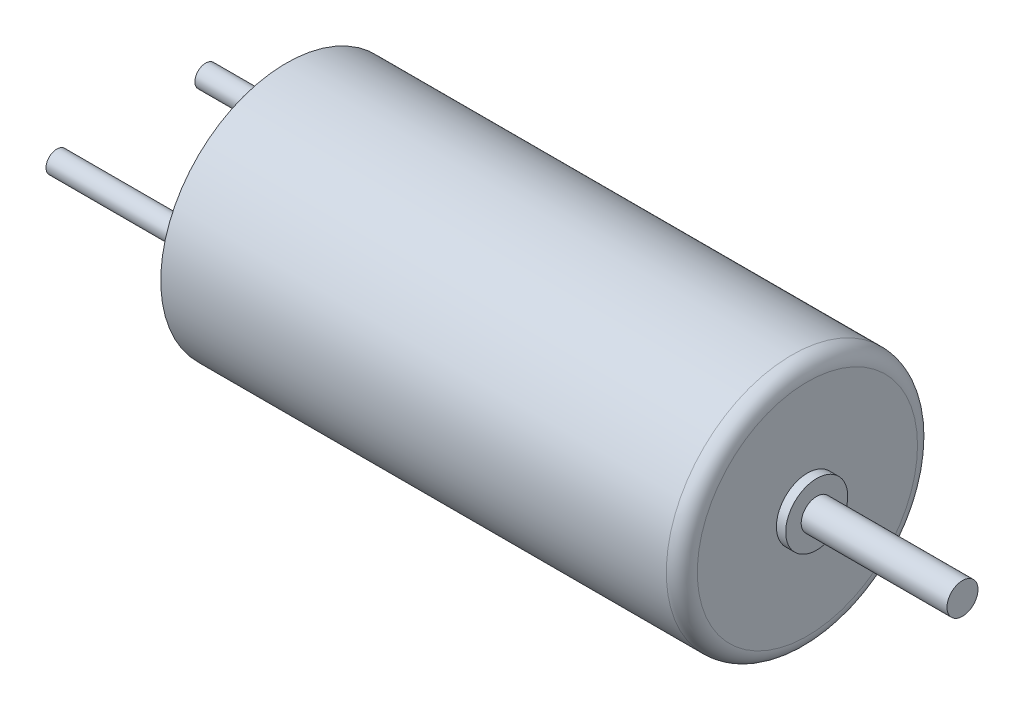
ISO-10303-21;
HEADER;
FILE_DESCRIPTION(('STEP AP214'),'2;1');
FILE_NAME('part.step','',(''),(''),'','','');
FILE_SCHEMA(('AUTOMOTIVE_DESIGN { 1 0 10303 214 1 1 1 1 }'));
ENDSEC;
DATA;
#1=APPLICATION_CONTEXT('core data for automotive mechanical design processes');
#2=APPLICATION_PROTOCOL_DEFINITION('international standard','automotive_design',2000,#1);
#3=PRODUCT_CONTEXT('',#1,'mechanical');
#4=PRODUCT('Part','Part','',(#3));
#5=PRODUCT_RELATED_PRODUCT_CATEGORY('part','',(#4));
#6=PRODUCT_DEFINITION_FORMATION('','',#4);
#7=PRODUCT_DEFINITION_CONTEXT('part definition',#1,'design');
#8=PRODUCT_DEFINITION('design','',#6,#7);
#9=PRODUCT_DEFINITION_SHAPE('','',#8);
#10=(LENGTH_UNIT() NAMED_UNIT(*) SI_UNIT(.MILLI.,.METRE.));
#11=(NAMED_UNIT(*) PLANE_ANGLE_UNIT() SI_UNIT($,.RADIAN.));
#12=(NAMED_UNIT(*) SI_UNIT($,.STERADIAN.) SOLID_ANGLE_UNIT());
#13=UNCERTAINTY_MEASURE_WITH_UNIT(LENGTH_MEASURE(1.E-05),#10,'distance_accuracy_value','');
#14=(GEOMETRIC_REPRESENTATION_CONTEXT(3) GLOBAL_UNCERTAINTY_ASSIGNED_CONTEXT((#13)) GLOBAL_UNIT_ASSIGNED_CONTEXT((#10,
#11,#12)) REPRESENTATION_CONTEXT('',''));
#15=CARTESIAN_POINT('',(0.,0.,0.));
#16=DIRECTION('',(0.,0.,1.));
#17=DIRECTION('',(1.,0.,0.));
#18=AXIS2_PLACEMENT_3D('',#15,#16,#17);
#19=CARTESIAN_POINT('',(16.8,0.,0.));
#20=DIRECTION('',(-1.,0.,0.));
#21=DIRECTION('',(0.,0.,1.));
#22=AXIS2_PLACEMENT_3D('',#19,#20,#21);
#23=CYLINDRICAL_SURFACE('',#22,4.05);
#24=CARTESIAN_POINT('',(16.3,0.,0.));
#25=DIRECTION('',(1.,0.,0.));
#26=DIRECTION('',(0.,0.,-1.));
#27=AXIS2_PLACEMENT_3D('',#24,#25,#26);
#28=CIRCLE('',#27,4.05);
#29=CARTESIAN_POINT('',(16.3,0.,-4.05));
#30=VERTEX_POINT('',#29);
#31=EDGE_CURVE('E10',#30,#30,#28,.F.);
#32=ORIENTED_EDGE('',*,*,#31,.T.);
#33=EDGE_LOOP('',(#32));
#34=FACE_BOUND('',#33,.T.);
#35=CARTESIAN_POINT('',(0.,0.,0.));
#36=DIRECTION('',(1.,0.,0.));
#37=DIRECTION('',(0.,0.,-1.));
#38=AXIS2_PLACEMENT_3D('',#35,#36,#37);
#39=CIRCLE('',#38,4.05);
#40=CARTESIAN_POINT('',(0.,0.,-4.05));
#41=VERTEX_POINT('',#40);
#42=EDGE_CURVE('E67',#41,#41,#39,.T.);
#43=ORIENTED_EDGE('',*,*,#42,.T.);
#44=EDGE_LOOP('',(#43));
#45=FACE_BOUND('',#44,.T.);
#46=ADVANCED_FACE('F42',(#34,#45),#23,.T.);
#47=CARTESIAN_POINT('',(16.8,0.,0.));
#48=DIRECTION('',(1.,0.,0.));
#49=DIRECTION('',(0.,0.,-1.));
#50=AXIS2_PLACEMENT_3D('',#47,#48,#49);
#51=PLANE('',#50);
#52=CARTESIAN_POINT('',(16.8,0.,0.));
#53=DIRECTION('',(1.,0.,0.));
#54=DIRECTION('',(0.,0.,-1.));
#55=AXIS2_PLACEMENT_3D('',#52,#53,#54);
#56=CIRCLE('',#55,3.55);
#57=CARTESIAN_POINT('',(16.8,0.,-3.55));
#58=VERTEX_POINT('',#57);
#59=EDGE_CURVE('E50',#58,#58,#56,.T.);
#60=ORIENTED_EDGE('',*,*,#59,.T.);
#61=EDGE_LOOP('',(#60));
#62=FACE_BOUND('',#61,.T.);
#63=CARTESIAN_POINT('',(16.8,0.,0.));
#64=DIRECTION('',(1.,0.,0.));
#65=DIRECTION('',(0.,0.,-1.));
#66=AXIS2_PLACEMENT_3D('',#63,#64,#65);
#67=CIRCLE('',#66,1.);
#68=CARTESIAN_POINT('',(16.8,0.,-1.));
#69=VERTEX_POINT('',#68);
#70=EDGE_CURVE('E71',#69,#69,#67,.T.);
#71=ORIENTED_EDGE('',*,*,#70,.F.);
#72=EDGE_LOOP('',(#71));
#73=FACE_BOUND('',#72,.T.);
#74=ADVANCED_FACE('F108',(#62,#73),#51,.T.);
#75=CARTESIAN_POINT('',(0.,0.,0.));
#76=DIRECTION('',(1.,0.,0.));
#77=DIRECTION('',(0.,0.,-1.));
#78=AXIS2_PLACEMENT_3D('',#75,#76,#77);
#79=PLANE('',#78);
#80=CARTESIAN_POINT('',(0.,0.,-2.4));
#81=DIRECTION('',(1.,0.,0.));
#82=DIRECTION('',(0.,0.,-1.));
#83=AXIS2_PLACEMENT_3D('',#80,#81,#82);
#84=CIRCLE('',#83,0.35);
#85=CARTESIAN_POINT('',(0.,0.,-2.75));
#86=VERTEX_POINT('',#85);
#87=EDGE_CURVE('E55',#86,#86,#84,.F.);
#88=ORIENTED_EDGE('',*,*,#87,.F.);
#89=EDGE_LOOP('',(#88));
#90=FACE_BOUND('',#89,.T.);
#91=CARTESIAN_POINT('',(0.,0.,2.4));
#92=DIRECTION('',(1.,0.,0.));
#93=DIRECTION('',(0.,0.,-1.));
#94=AXIS2_PLACEMENT_3D('',#91,#92,#93);
#95=CIRCLE('',#94,0.35);
#96=CARTESIAN_POINT('',(0.,0.,2.05));
#97=VERTEX_POINT('',#96);
#98=EDGE_CURVE('E60',#97,#97,#95,.F.);
#99=ORIENTED_EDGE('',*,*,#98,.F.);
#100=EDGE_LOOP('',(#99));
#101=FACE_BOUND('',#100,.T.);
#102=ORIENTED_EDGE('',*,*,#42,.F.);
#103=EDGE_LOOP('',(#102));
#104=FACE_BOUND('',#103,.T.);
#105=ADVANCED_FACE('F104',(#90,#101,#104),#79,.F.);
#106=CARTESIAN_POINT('',(17.1,0.,0.));
#107=DIRECTION('',(-1.,0.,0.));
#108=DIRECTION('',(0.,0.,1.));
#109=AXIS2_PLACEMENT_3D('',#106,#107,#108);
#110=CYLINDRICAL_SURFACE('',#109,1.);
#111=CARTESIAN_POINT('',(17.1,0.,0.));
#112=DIRECTION('',(1.,0.,0.));
#113=DIRECTION('',(0.,0.,-1.));
#114=AXIS2_PLACEMENT_3D('',#111,#112,#113);
#115=CIRCLE('',#114,1.);
#116=CARTESIAN_POINT('',(17.1,0.,-1.));
#117=VERTEX_POINT('',#116);
#118=EDGE_CURVE('E72',#117,#117,#115,.T.);
#119=ORIENTED_EDGE('',*,*,#118,.F.);
#120=EDGE_LOOP('',(#119));
#121=FACE_BOUND('',#120,.T.);
#122=ORIENTED_EDGE('',*,*,#70,.T.);
#123=EDGE_LOOP('',(#122));
#124=FACE_BOUND('',#123,.T.);
#125=ADVANCED_FACE('F107',(#121,#124),#110,.T.);
#126=CARTESIAN_POINT('',(17.1,0.,0.));
#127=DIRECTION('',(1.,0.,0.));
#128=DIRECTION('',(0.,0.,-1.));
#129=AXIS2_PLACEMENT_3D('',#126,#127,#128);
#130=PLANE('',#129);
#131=CARTESIAN_POINT('',(17.1,0.,0.));
#132=DIRECTION('',(1.,0.,0.));
#133=DIRECTION('',(0.,0.,-1.));
#134=AXIS2_PLACEMENT_3D('',#131,#132,#133);
#135=CIRCLE('',#134,0.5);
#136=CARTESIAN_POINT('',(17.1,0.,-0.5));
#137=VERTEX_POINT('',#136);
#138=EDGE_CURVE('E66',#137,#137,#135,.T.);
#139=ORIENTED_EDGE('',*,*,#138,.F.);
#140=EDGE_LOOP('',(#139));
#141=FACE_BOUND('',#140,.T.);
#142=ORIENTED_EDGE('',*,*,#118,.T.);
#143=EDGE_LOOP('',(#142));
#144=FACE_BOUND('',#143,.T.);
#145=ADVANCED_FACE('F123',(#141,#144),#130,.T.);
#146=CARTESIAN_POINT('',(21.8,0.,0.));
#147=DIRECTION('',(-1.,0.,0.));
#148=DIRECTION('',(0.,0.,1.));
#149=AXIS2_PLACEMENT_3D('',#146,#147,#148);
#150=CYLINDRICAL_SURFACE('',#149,0.5);
#151=CARTESIAN_POINT('',(21.8,0.,0.));
#152=DIRECTION('',(1.,0.,0.));
#153=DIRECTION('',(0.,0.,-1.));
#154=AXIS2_PLACEMENT_3D('',#151,#152,#153);
#155=CIRCLE('',#154,0.5);
#156=CARTESIAN_POINT('',(21.8,0.,-0.5));
#157=VERTEX_POINT('',#156);
#158=EDGE_CURVE('E79',#157,#157,#155,.T.);
#159=ORIENTED_EDGE('',*,*,#158,.F.);
#160=EDGE_LOOP('',(#159));
#161=FACE_BOUND('',#160,.T.);
#162=ORIENTED_EDGE('',*,*,#138,.T.);
#163=EDGE_LOOP('',(#162));
#164=FACE_BOUND('',#163,.T.);
#165=ADVANCED_FACE('F127',(#161,#164),#150,.T.);
#166=CARTESIAN_POINT('',(21.8,0.,0.));
#167=DIRECTION('',(1.,0.,0.));
#168=DIRECTION('',(0.,0.,-1.));
#169=AXIS2_PLACEMENT_3D('',#166,#167,#168);
#170=PLANE('',#169);
#171=ORIENTED_EDGE('',*,*,#158,.T.);
#172=EDGE_LOOP('',(#171));
#173=FACE_BOUND('',#172,.T.);
#174=ADVANCED_FACE('F131',(#173),#170,.T.);
#175=CARTESIAN_POINT('',(-5.,0.,2.4));
#176=DIRECTION('',(1.,0.,0.));
#177=DIRECTION('',(0.,0.,-1.));
#178=AXIS2_PLACEMENT_3D('',#175,#176,#177);
#179=CYLINDRICAL_SURFACE('',#178,0.35);
#180=CARTESIAN_POINT('',(-5.,0.,2.4));
#181=DIRECTION('',(-1.,0.,0.));
#182=DIRECTION('',(0.,0.,1.));
#183=AXIS2_PLACEMENT_3D('',#180,#181,#182);
#184=CIRCLE('',#183,0.35);
#185=CARTESIAN_POINT('',(-5.,0.,2.75));
#186=VERTEX_POINT('',#185);
#187=EDGE_CURVE('E86',#186,#186,#184,.T.);
#188=ORIENTED_EDGE('',*,*,#187,.F.);
#189=EDGE_LOOP('',(#188));
#190=FACE_BOUND('',#189,.T.);
#191=ORIENTED_EDGE('',*,*,#98,.T.);
#192=EDGE_LOOP('',(#191));
#193=FACE_BOUND('',#192,.T.);
#194=ADVANCED_FACE('F135',(#190,#193),#179,.T.);
#195=CARTESIAN_POINT('',(-5.,0.,2.4));
#196=DIRECTION('',(-1.,0.,0.));
#197=DIRECTION('',(0.,0.,1.));
#198=AXIS2_PLACEMENT_3D('',#195,#196,#197);
#199=PLANE('',#198);
#200=ORIENTED_EDGE('',*,*,#187,.T.);
#201=EDGE_LOOP('',(#200));
#202=FACE_BOUND('',#201,.T.);
#203=ADVANCED_FACE('F100',(#202),#199,.T.);
#204=CARTESIAN_POINT('',(-5.,0.,-2.4));
#205=DIRECTION('',(1.,0.,0.));
#206=DIRECTION('',(0.,0.,-1.));
#207=AXIS2_PLACEMENT_3D('',#204,#205,#206);
#208=CYLINDRICAL_SURFACE('',#207,0.35);
#209=CARTESIAN_POINT('',(-5.,0.,-2.4));
#210=DIRECTION('',(-1.,0.,0.));
#211=DIRECTION('',(0.,0.,1.));
#212=AXIS2_PLACEMENT_3D('',#209,#210,#211);
#213=CIRCLE('',#212,0.35);
#214=CARTESIAN_POINT('',(-5.,0.,-2.05));
#215=VERTEX_POINT('',#214);
#216=EDGE_CURVE('E90',#215,#215,#213,.T.);
#217=ORIENTED_EDGE('',*,*,#216,.F.);
#218=EDGE_LOOP('',(#217));
#219=FACE_BOUND('',#218,.T.);
#220=ORIENTED_EDGE('',*,*,#87,.T.);
#221=EDGE_LOOP('',(#220));
#222=FACE_BOUND('',#221,.T.);
#223=ADVANCED_FACE('F97',(#219,#222),#208,.T.);
#224=CARTESIAN_POINT('',(-5.,0.,-2.4));
#225=DIRECTION('',(-1.,0.,0.));
#226=DIRECTION('',(0.,0.,1.));
#227=AXIS2_PLACEMENT_3D('',#224,#225,#226);
#228=PLANE('',#227);
#229=ORIENTED_EDGE('',*,*,#216,.T.);
#230=EDGE_LOOP('',(#229));
#231=FACE_BOUND('',#230,.T.);
#232=ADVANCED_FACE('F95',(#231),#228,.T.);
#233=CARTESIAN_POINT('',(16.3,0.,0.));
#234=DIRECTION('',(1.,0.,0.));
#235=DIRECTION('',(0.,0.,-1.));
#236=AXIS2_PLACEMENT_3D('',#233,#234,#235);
#237=TOROIDAL_SURFACE('',#236,3.55,0.5);
#238=ORIENTED_EDGE('',*,*,#31,.F.);
#239=EDGE_LOOP('',(#238));
#240=FACE_BOUND('',#239,.T.);
#241=ORIENTED_EDGE('',*,*,#59,.F.);
#242=EDGE_LOOP('',(#241));
#243=FACE_BOUND('',#242,.T.);
#244=ADVANCED_FACE('F44',(#240,#243),#237,.T.);
#245=CLOSED_SHELL('',(#46,#74,#105,#125,#145,#165,#174,#194,#203,#223,#232,#244));
#246=MANIFOLD_SOLID_BREP('B2',#245);
#247=ADVANCED_BREP_SHAPE_REPRESENTATION('',(#18,#246),#14);
#248=SHAPE_DEFINITION_REPRESENTATION(#9,#247);
ENDSEC;
END-ISO-10303-21;
